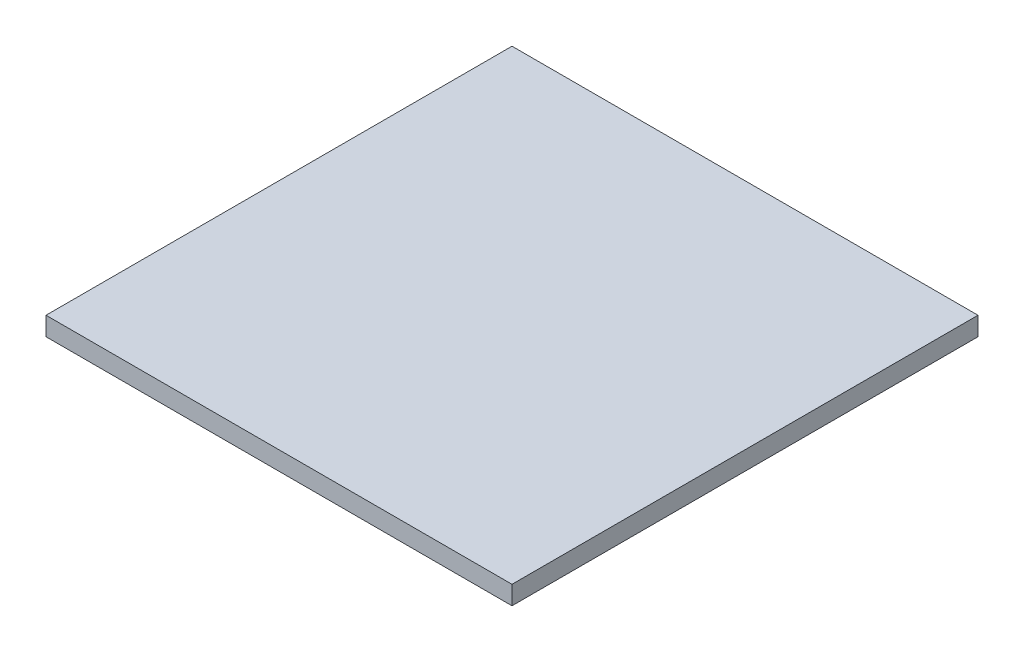
ISO-10303-21;
HEADER;
FILE_DESCRIPTION(('STEP AP214'),'2;1');
FILE_NAME('part.step','',(''),(''),'','','');
FILE_SCHEMA(('AUTOMOTIVE_DESIGN { 1 0 10303 214 1 1 1 1 }'));
ENDSEC;
DATA;
#1=APPLICATION_CONTEXT('core data for automotive mechanical design processes');
#2=APPLICATION_PROTOCOL_DEFINITION('international standard','automotive_design',2000,#1);
#3=PRODUCT_CONTEXT('',#1,'mechanical');
#4=PRODUCT('Part','Part','',(#3));
#5=PRODUCT_RELATED_PRODUCT_CATEGORY('part','',(#4));
#6=PRODUCT_DEFINITION_FORMATION('','',#4);
#7=PRODUCT_DEFINITION_CONTEXT('part definition',#1,'design');
#8=PRODUCT_DEFINITION('design','',#6,#7);
#9=PRODUCT_DEFINITION_SHAPE('','',#8);
#10=(LENGTH_UNIT() NAMED_UNIT(*) SI_UNIT(.MILLI.,.METRE.));
#11=(NAMED_UNIT(*) PLANE_ANGLE_UNIT() SI_UNIT($,.RADIAN.));
#12=(NAMED_UNIT(*) SI_UNIT($,.STERADIAN.) SOLID_ANGLE_UNIT());
#13=UNCERTAINTY_MEASURE_WITH_UNIT(LENGTH_MEASURE(1.E-05),#10,'distance_accuracy_value','');
#14=(GEOMETRIC_REPRESENTATION_CONTEXT(3) GLOBAL_UNCERTAINTY_ASSIGNED_CONTEXT((#13)) GLOBAL_UNIT_ASSIGNED_CONTEXT((#10,
#11,#12)) REPRESENTATION_CONTEXT('',''));
#15=CARTESIAN_POINT('',(0.,0.,0.));
#16=DIRECTION('',(0.,0.,1.));
#17=DIRECTION('',(1.,0.,0.));
#18=AXIS2_PLACEMENT_3D('',#15,#16,#17);
#19=CARTESIAN_POINT('',(-250.,20.,250.));
#20=DIRECTION('',(0.,0.,-1.));
#21=DIRECTION('',(-1.,0.,0.));
#22=AXIS2_PLACEMENT_3D('',#19,#20,#21);
#23=PLANE('',#22);
#24=DIRECTION('',(1.,0.,0.));
#25=VECTOR('',#24,1.);
#26=CARTESIAN_POINT('',(-250.,0.,250.));
#27=LINE('',#26,#25);
#28=CARTESIAN_POINT('',(-250.,0.,250.));
#29=VERTEX_POINT('',#28);
#30=CARTESIAN_POINT('',(250.,0.,250.));
#31=VERTEX_POINT('',#30);
#32=EDGE_CURVE('E99',#29,#31,#27,.T.);
#33=ORIENTED_EDGE('',*,*,#32,.T.);
#34=DIRECTION('',(0.,-1.,0.));
#35=VECTOR('',#34,1.);
#36=CARTESIAN_POINT('',(250.,20.,250.));
#37=LINE('',#36,#35);
#38=CARTESIAN_POINT('',(250.,20.,250.));
#39=VERTEX_POINT('',#38);
#40=EDGE_CURVE('E11',#39,#31,#37,.T.);
#41=ORIENTED_EDGE('',*,*,#40,.F.);
#42=DIRECTION('',(1.,0.,0.));
#43=VECTOR('',#42,1.);
#44=CARTESIAN_POINT('',(-250.,20.,250.));
#45=LINE('',#44,#43);
#46=CARTESIAN_POINT('',(-250.,20.,250.));
#47=VERTEX_POINT('',#46);
#48=EDGE_CURVE('E85',#47,#39,#45,.T.);
#49=ORIENTED_EDGE('',*,*,#48,.F.);
#50=DIRECTION('',(0.,-1.,0.));
#51=VECTOR('',#50,1.);
#52=CARTESIAN_POINT('',(-250.,20.,250.));
#53=LINE('',#52,#51);
#54=EDGE_CURVE('E52',#47,#29,#53,.T.);
#55=ORIENTED_EDGE('',*,*,#54,.T.);
#56=EDGE_LOOP('',(#33,#41,#49,#55));
#57=FACE_BOUND('',#56,.T.);
#58=ADVANCED_FACE('F36',(#57),#23,.F.);
#59=CARTESIAN_POINT('',(250.,20.,250.));
#60=DIRECTION('',(-1.,0.,0.));
#61=DIRECTION('',(0.,0.,1.));
#62=AXIS2_PLACEMENT_3D('',#59,#60,#61);
#63=PLANE('',#62);
#64=DIRECTION('',(0.,0.,-1.));
#65=VECTOR('',#64,1.);
#66=CARTESIAN_POINT('',(250.,0.,250.));
#67=LINE('',#66,#65);
#68=CARTESIAN_POINT('',(250.,0.,-250.));
#69=VERTEX_POINT('',#68);
#70=EDGE_CURVE('E90',#31,#69,#67,.T.);
#71=ORIENTED_EDGE('',*,*,#70,.T.);
#72=DIRECTION('',(0.,-1.,0.));
#73=VECTOR('',#72,1.);
#74=CARTESIAN_POINT('',(250.,20.,-250.));
#75=LINE('',#74,#73);
#76=CARTESIAN_POINT('',(250.,20.,-250.));
#77=VERTEX_POINT('',#76);
#78=EDGE_CURVE('E44',#77,#69,#75,.T.);
#79=ORIENTED_EDGE('',*,*,#78,.F.);
#80=DIRECTION('',(0.,0.,-1.));
#81=VECTOR('',#80,1.);
#82=CARTESIAN_POINT('',(250.,20.,250.));
#83=LINE('',#82,#81);
#84=EDGE_CURVE('E77',#39,#77,#83,.T.);
#85=ORIENTED_EDGE('',*,*,#84,.F.);
#86=ORIENTED_EDGE('',*,*,#40,.T.);
#87=EDGE_LOOP('',(#71,#79,#85,#86));
#88=FACE_BOUND('',#87,.T.);
#89=ADVANCED_FACE('F89',(#88),#63,.F.);
#90=CARTESIAN_POINT('',(-250.,20.,-250.));
#91=DIRECTION('',(0.,0.,-1.));
#92=DIRECTION('',(-1.,0.,0.));
#93=AXIS2_PLACEMENT_3D('',#90,#91,#92);
#94=PLANE('',#93);
#95=DIRECTION('',(1.,0.,0.));
#96=VECTOR('',#95,1.);
#97=CARTESIAN_POINT('',(-250.,0.,-250.));
#98=LINE('',#97,#96);
#99=CARTESIAN_POINT('',(-250.,0.,-250.));
#100=VERTEX_POINT('',#99);
#101=EDGE_CURVE('E102',#100,#69,#98,.T.);
#102=ORIENTED_EDGE('',*,*,#101,.F.);
#103=DIRECTION('',(0.,-1.,0.));
#104=VECTOR('',#103,1.);
#105=CARTESIAN_POINT('',(-250.,20.,-250.));
#106=LINE('',#105,#104);
#107=CARTESIAN_POINT('',(-250.,20.,-250.));
#108=VERTEX_POINT('',#107);
#109=EDGE_CURVE('E66',#108,#100,#106,.T.);
#110=ORIENTED_EDGE('',*,*,#109,.F.);
#111=DIRECTION('',(1.,0.,0.));
#112=VECTOR('',#111,1.);
#113=CARTESIAN_POINT('',(-250.,20.,-250.));
#114=LINE('',#113,#112);
#115=EDGE_CURVE('E84',#108,#77,#114,.T.);
#116=ORIENTED_EDGE('',*,*,#115,.T.);
#117=ORIENTED_EDGE('',*,*,#78,.T.);
#118=EDGE_LOOP('',(#102,#110,#116,#117));
#119=FACE_BOUND('',#118,.T.);
#120=ADVANCED_FACE('F93',(#119),#94,.T.);
#121=CARTESIAN_POINT('',(-250.,20.,250.));
#122=DIRECTION('',(-1.,0.,0.));
#123=DIRECTION('',(0.,0.,1.));
#124=AXIS2_PLACEMENT_3D('',#121,#122,#123);
#125=PLANE('',#124);
#126=DIRECTION('',(0.,0.,-1.));
#127=VECTOR('',#126,1.);
#128=CARTESIAN_POINT('',(-250.,0.,250.));
#129=LINE('',#128,#127);
#130=EDGE_CURVE('E104',#29,#100,#129,.T.);
#131=ORIENTED_EDGE('',*,*,#130,.F.);
#132=ORIENTED_EDGE('',*,*,#54,.F.);
#133=DIRECTION('',(0.,0.,-1.));
#134=VECTOR('',#133,1.);
#135=CARTESIAN_POINT('',(-250.,20.,250.));
#136=LINE('',#135,#134);
#137=EDGE_CURVE('E94',#47,#108,#136,.T.);
#138=ORIENTED_EDGE('',*,*,#137,.T.);
#139=ORIENTED_EDGE('',*,*,#109,.T.);
#140=EDGE_LOOP('',(#131,#132,#138,#139));
#141=FACE_BOUND('',#140,.T.);
#142=ADVANCED_FACE('F110',(#141),#125,.T.);
#143=CARTESIAN_POINT('',(0.,20.,0.));
#144=DIRECTION('',(0.,1.,0.));
#145=DIRECTION('',(0.,0.,1.));
#146=AXIS2_PLACEMENT_3D('',#143,#144,#145);
#147=PLANE('',#146);
#148=ORIENTED_EDGE('',*,*,#48,.T.);
#149=ORIENTED_EDGE('',*,*,#84,.T.);
#150=ORIENTED_EDGE('',*,*,#115,.F.);
#151=ORIENTED_EDGE('',*,*,#137,.F.);
#152=EDGE_LOOP('',(#148,#149,#150,#151));
#153=FACE_BOUND('',#152,.T.);
#154=ADVANCED_FACE('F81',(#153),#147,.T.);
#155=CARTESIAN_POINT('',(0.,0.,0.));
#156=DIRECTION('',(0.,1.,0.));
#157=DIRECTION('',(0.,0.,1.));
#158=AXIS2_PLACEMENT_3D('',#155,#156,#157);
#159=PLANE('',#158);
#160=ORIENTED_EDGE('',*,*,#32,.F.);
#161=ORIENTED_EDGE('',*,*,#130,.T.);
#162=ORIENTED_EDGE('',*,*,#101,.T.);
#163=ORIENTED_EDGE('',*,*,#70,.F.);
#164=EDGE_LOOP('',(#160,#161,#162,#163));
#165=FACE_BOUND('',#164,.T.);
#166=ADVANCED_FACE('F109',(#165),#159,.F.);
#167=CLOSED_SHELL('',(#58,#89,#120,#142,#154,#166));
#168=MANIFOLD_SOLID_BREP('B2',#167);
#169=ADVANCED_BREP_SHAPE_REPRESENTATION('',(#18,#168),#14);
#170=SHAPE_DEFINITION_REPRESENTATION(#9,#169);
ENDSEC;
END-ISO-10303-21;
